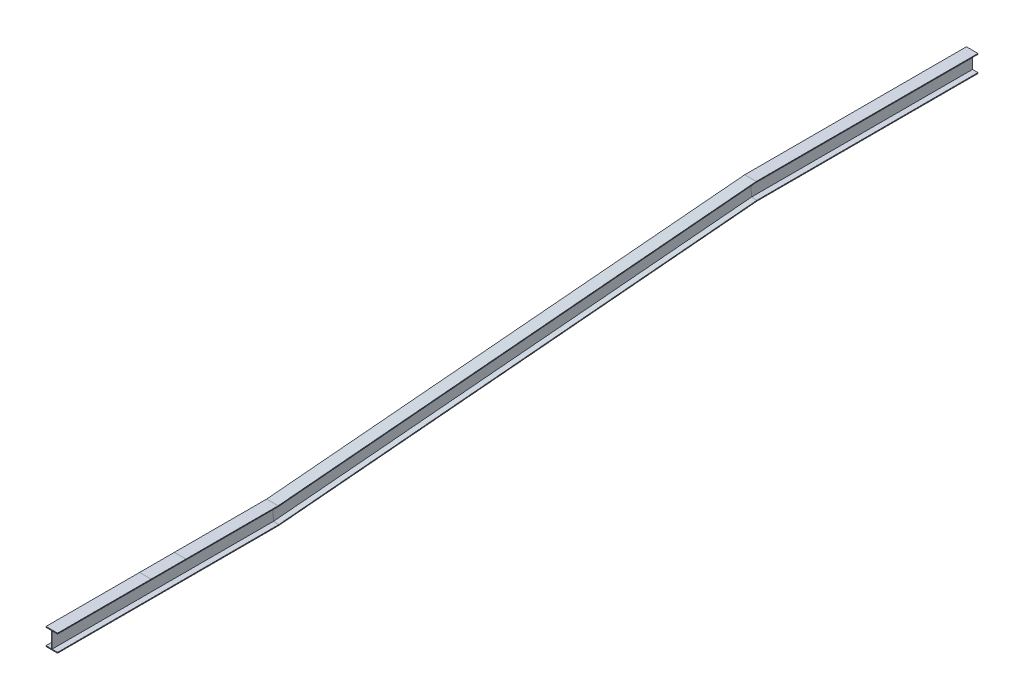
ISO-10303-21;
HEADER;
FILE_DESCRIPTION(('STEP AP214'),'2;1');
FILE_NAME('part.step','',(''),(''),'','','');
FILE_SCHEMA(('AUTOMOTIVE_DESIGN { 1 0 10303 214 1 1 1 1 }'));
ENDSEC;
DATA;
#1=APPLICATION_CONTEXT('core data for automotive mechanical design processes');
#2=APPLICATION_PROTOCOL_DEFINITION('international standard','automotive_design',2000,#1);
#3=PRODUCT_CONTEXT('',#1,'mechanical');
#4=PRODUCT('Part','Part','',(#3));
#5=PRODUCT_RELATED_PRODUCT_CATEGORY('part','',(#4));
#6=PRODUCT_DEFINITION_FORMATION('','',#4);
#7=PRODUCT_DEFINITION_CONTEXT('part definition',#1,'design');
#8=PRODUCT_DEFINITION('design','',#6,#7);
#9=PRODUCT_DEFINITION_SHAPE('','',#8);
#10=(LENGTH_UNIT() NAMED_UNIT(*) SI_UNIT(.MILLI.,.METRE.));
#11=(NAMED_UNIT(*) PLANE_ANGLE_UNIT() SI_UNIT($,.RADIAN.));
#12=(NAMED_UNIT(*) SI_UNIT($,.STERADIAN.) SOLID_ANGLE_UNIT());
#13=UNCERTAINTY_MEASURE_WITH_UNIT(LENGTH_MEASURE(1.E-05),#10,'distance_accuracy_value','');
#14=(GEOMETRIC_REPRESENTATION_CONTEXT(3) GLOBAL_UNCERTAINTY_ASSIGNED_CONTEXT((#13)) GLOBAL_UNIT_ASSIGNED_CONTEXT((#10,
#11,#12)) REPRESENTATION_CONTEXT('',''));
#15=CARTESIAN_POINT('',(0.,0.,0.));
#16=DIRECTION('',(0.,0.,1.));
#17=DIRECTION('',(1.,0.,0.));
#18=AXIS2_PLACEMENT_3D('',#15,#16,#17);
#19=CARTESIAN_POINT('',(0.,-0.000240532957995754,0.));
#20=DIRECTION('',(0.,-1.00000000000002,0.));
#21=DIRECTION('',(0.999999999999975,0.,0.));
#22=AXIS2_PLACEMENT_3D('',#19,#20,#21);
#23=PLANE('',#22);
#24=DIRECTION('',(-0.999999999999975,0.,0.));
#25=VECTOR('',#24,1.);
#26=CARTESIAN_POINT('',(0.,-0.000240532933570847,-1115.72820066556));
#27=LINE('',#26,#25);
#28=CARTESIAN_POINT('',(101.599999999999,-0.000240532933570847,-1115.72820066556));
#29=VERTEX_POINT('',#28);
#30=CARTESIAN_POINT('',(0.,-0.000240532933570847,-1115.72820066556));
#31=VERTEX_POINT('',#30);
#32=EDGE_CURVE('E11',#29,#31,#27,.T.);
#33=ORIENTED_EDGE('',*,*,#32,.F.);
#34=DIRECTION('',(0.,0.,-0.999999999999988));
#35=VECTOR('',#34,1.);
#36=CARTESIAN_POINT('',(101.599999999999,-0.000240532957995754,9.9475983006414E-11));
#37=LINE('',#36,#35);
#38=CARTESIAN_POINT('',(101.599999999994,-0.000240532933570847,-1926.65640133112));
#39=VERTEX_POINT('',#38);
#40=EDGE_CURVE('E228',#29,#39,#37,.T.);
#41=ORIENTED_EDGE('',*,*,#40,.T.);
#42=DIRECTION('',(0.999999999999975,0.,0.));
#43=VECTOR('',#42,1.);
#44=CARTESIAN_POINT('',(-6.21724893790088E-12,-0.000240532933570847,-1926.65640133112));
#45=LINE('',#44,#43);
#46=CARTESIAN_POINT('',(-6.21724893790088E-12,-0.000240532933570847,-1926.65640133112));
#47=VERTEX_POINT('',#46);
#48=EDGE_CURVE('E331',#47,#39,#45,.T.);
#49=ORIENTED_EDGE('',*,*,#48,.F.);
#50=DIRECTION('',(0.,0.,-0.999999999999988));
#51=VECTOR('',#50,1.);
#52=CARTESIAN_POINT('',(0.,-0.000240532957995754,0.));
#53=LINE('',#52,#51);
#54=EDGE_CURVE('E365',#31,#47,#53,.T.);
#55=ORIENTED_EDGE('',*,*,#54,.F.);
#56=EDGE_LOOP('',(#33,#41,#49,#55));
#57=FACE_BOUND('',#56,.T.);
#58=ADVANCED_FACE('F38',(#57),#23,.F.);
#59=DIRECTION('',(0.999999999999975,0.,0.));
#60=VECTOR('',#59,1.);
#61=CARTESIAN_POINT('',(0.,-0.000240532957995754,-810.928200665561));
#62=LINE('',#61,#60);
#63=CARTESIAN_POINT('',(0.,-0.000240532957995754,-810.928200665561));
#64=VERTEX_POINT('',#63);
#65=CARTESIAN_POINT('',(101.6,-0.000240532957995754,-810.928200665559));
#66=VERTEX_POINT('',#65);
#67=EDGE_CURVE('E47',#64,#66,#62,.T.);
#68=ORIENTED_EDGE('',*,*,#67,.F.);
#69=CARTESIAN_POINT('',(-4.9737991503207E-11,-0.000240532957995754,11.1091776840375));
#70=VERTEX_POINT('',#69);
#71=EDGE_CURVE('E367',#70,#64,#53,.T.);
#72=ORIENTED_EDGE('',*,*,#71,.F.);
#73=DIRECTION('',(-0.999999999999975,0.,0.));
#74=VECTOR('',#73,1.);
#75=CARTESIAN_POINT('',(101.599999999952,-0.000240532957995754,11.1091776839416));
#76=LINE('',#75,#74);
#77=CARTESIAN_POINT('',(101.599999999951,-0.000240532957995754,11.1091776839416));
#78=VERTEX_POINT('',#77);
#79=EDGE_CURVE('E239',#78,#70,#76,.T.);
#80=ORIENTED_EDGE('',*,*,#79,.F.);
#81=EDGE_CURVE('E235',#78,#66,#37,.T.);
#82=ORIENTED_EDGE('',*,*,#81,.T.);
#83=EDGE_LOOP('',(#68,#72,#80,#82));
#84=FACE_BOUND('',#83,.T.);
#85=ADVANCED_FACE('F477',(#84),#23,.F.);
#86=CARTESIAN_POINT('',(47.5660357142855,221.295206381576,-6124.99971287875));
#87=DIRECTION('',(0.999999999999975,0.,0.));
#88=DIRECTION('',(0.,0.,-0.999999999999988));
#89=AXIS2_PLACEMENT_3D('',#86,#87,#88);
#90=PLANE('',#89);
#91=DIRECTION('',(0.,0.999048221581882,0.0436193873653391));
#92=VECTOR('',#91,1.);
#93=CARTESIAN_POINT('',(47.5660357142367,37.5900227922892,-6139.83149499006));
#94=LINE('',#93,#92);
#95=CARTESIAN_POINT('',(47.5660357142855,221.295206381576,-6131.81075345742));
#96=VERTEX_POINT('',#95);
#97=CARTESIAN_POINT('',(47.5660357142855,360.233206381576,-6125.7445893716));
#98=VERTEX_POINT('',#97);
#99=EDGE_CURVE('E408',#96,#98,#94,.T.);
#100=ORIENTED_EDGE('',*,*,#99,.T.);
#101=DIRECTION('',(0.,0.,-0.999999999999988));
#102=VECTOR('',#101,1.);
#103=CARTESIAN_POINT('',(47.5660357142855,360.233206381576,-6124.99971287875));
#104=LINE('',#103,#102);
#105=CARTESIAN_POINT('',(47.5660357142793,360.233206381601,-8073.3192700833));
#106=VERTEX_POINT('',#105);
#107=EDGE_CURVE('E413',#98,#106,#104,.T.);
#108=ORIENTED_EDGE('',*,*,#107,.T.);
#109=DIRECTION('',(0.,1.00000000000002,0.));
#110=VECTOR('',#109,1.);
#111=CARTESIAN_POINT('',(47.5660357142367,221.295206381602,-8073.3192700832));
#112=LINE('',#111,#110);
#113=CARTESIAN_POINT('',(47.5660357142367,221.295206381601,-8073.3192700832));
#114=VERTEX_POINT('',#113);
#115=EDGE_CURVE('E245',#114,#106,#112,.T.);
#116=ORIENTED_EDGE('',*,*,#115,.F.);
#117=DIRECTION('',(0.,0.,-0.999999999999988));
#118=VECTOR('',#117,1.);
#119=CARTESIAN_POINT('',(47.5660357142855,221.295206381576,-6124.99971287875));
#120=LINE('',#119,#118);
#121=EDGE_CURVE('E467',#96,#114,#120,.T.);
#122=ORIENTED_EDGE('',*,*,#121,.F.);
#123=EDGE_LOOP('',(#100,#108,#116,#122));
#124=FACE_BOUND('',#123,.T.);
#125=ADVANCED_FACE('F576',(#124),#90,.F.);
#126=CARTESIAN_POINT('',(0.,221.295206381626,-6124.9997128787));
#127=DIRECTION('',(0.,-1.00000000000002,0.));
#128=DIRECTION('',(0.999999999999975,0.,0.));
#129=AXIS2_PLACEMENT_3D('',#126,#127,#128);
#130=PLANE('',#129);
#131=DIRECTION('',(0.999999999999975,0.,0.));
#132=VECTOR('',#131,1.);
#133=CARTESIAN_POINT('',(0.,221.295206381626,-6131.81075345737));
#134=LINE('',#133,#132);
#135=CARTESIAN_POINT('',(0.,221.295206381626,-6131.81075345737));
#136=VERTEX_POINT('',#135);
#137=EDGE_CURVE('E348',#136,#96,#134,.T.);
#138=ORIENTED_EDGE('',*,*,#137,.T.);
#139=ORIENTED_EDGE('',*,*,#121,.T.);
#140=DIRECTION('',(0.999999999999975,0.,0.));
#141=VECTOR('',#140,1.);
#142=CARTESIAN_POINT('',(-5.06261699229071E-11,221.29520638165,-8073.3192700832));
#143=LINE('',#142,#141);
#144=CARTESIAN_POINT('',(-4.9737991503207E-11,221.29520638165,-8073.3192700832));
#145=VERTEX_POINT('',#144);
#146=EDGE_CURVE('E276',#145,#114,#143,.T.);
#147=ORIENTED_EDGE('',*,*,#146,.F.);
#148=DIRECTION('',(0.,0.,-0.999999999999988));
#149=VECTOR('',#148,1.);
#150=CARTESIAN_POINT('',(0.,221.295206381626,-6124.9997128787));
#151=LINE('',#150,#149);
#152=EDGE_CURVE('E465',#136,#145,#151,.T.);
#153=ORIENTED_EDGE('',*,*,#152,.F.);
#154=EDGE_LOOP('',(#138,#139,#147,#153));
#155=FACE_BOUND('',#154,.T.);
#156=ADVANCED_FACE('F579',(#155),#130,.F.);
#157=CARTESIAN_POINT('',(0.,214.183206381625,-6124.9997128787));
#158=DIRECTION('',(0.999999999999975,0.,0.));
#159=DIRECTION('',(0.,0.,-0.999999999999988));
#160=AXIS2_PLACEMENT_3D('',#157,#158,#159);
#161=PLANE('',#160);
#162=DIRECTION('',(0.,0.999048221581882,0.0436193873653391));
#163=VECTOR('',#162,1.);
#164=CARTESIAN_POINT('',(-5.50670620214078E-11,30.4915544459243,-6140.14142081132));
#165=LINE('',#164,#163);
#166=CARTESIAN_POINT('',(0.,214.183206381626,-6132.12127008334));
#167=VERTEX_POINT('',#166);
#168=EDGE_CURVE('E378',#167,#136,#165,.T.);
#169=ORIENTED_EDGE('',*,*,#168,.T.);
#170=ORIENTED_EDGE('',*,*,#152,.T.);
#171=DIRECTION('',(0.,1.00000000000002,0.));
#172=VECTOR('',#171,1.);
#173=CARTESIAN_POINT('',(0.,214.183206381652,-8073.3192700832));
#174=LINE('',#173,#172);
#175=CARTESIAN_POINT('',(0.,214.18320638165,-8073.3192700832));
#176=VERTEX_POINT('',#175);
#177=EDGE_CURVE('E280',#176,#145,#174,.T.);
#178=ORIENTED_EDGE('',*,*,#177,.F.);
#179=DIRECTION('',(0.,0.,-0.999999999999988));
#180=VECTOR('',#179,1.);
#181=CARTESIAN_POINT('',(0.,214.183206381625,-6124.9997128787));
#182=LINE('',#181,#180);
#183=EDGE_CURVE('E463',#167,#176,#182,.T.);
#184=ORIENTED_EDGE('',*,*,#183,.F.);
#185=EDGE_LOOP('',(#169,#170,#178,#184));
#186=FACE_BOUND('',#185,.T.);
#187=ADVANCED_FACE('F582',(#186),#161,.F.);
#188=CARTESIAN_POINT('',(101.599999999993,214.183206381625,-6124.9997128787));
#189=DIRECTION('',(0.,1.00000000000002,0.));
#190=DIRECTION('',(0.,0.,0.999999999999988));
#191=AXIS2_PLACEMENT_3D('',#188,#189,#190);
#192=PLANE('',#191);
#193=DIRECTION('',(-0.999999999999975,0.,0.));
#194=VECTOR('',#193,1.);
#195=CARTESIAN_POINT('',(101.599999999999,214.183206381625,-6132.12127008334));
#196=LINE('',#195,#194);
#197=CARTESIAN_POINT('',(101.599999999999,214.183206381625,-6132.12127008334));
#198=VERTEX_POINT('',#197);
#199=EDGE_CURVE('E381',#198,#167,#196,.T.);
#200=ORIENTED_EDGE('',*,*,#199,.T.);
#201=ORIENTED_EDGE('',*,*,#183,.T.);
#202=DIRECTION('',(-0.999999999999975,0.,0.));
#203=VECTOR('',#202,1.);
#204=CARTESIAN_POINT('',(101.599999999997,214.18320638165,-8073.3192700833));
#205=LINE('',#204,#203);
#206=CARTESIAN_POINT('',(101.599999999999,214.18320638165,-8073.3192700833));
#207=VERTEX_POINT('',#206);
#208=EDGE_CURVE('E283',#207,#176,#205,.T.);
#209=ORIENTED_EDGE('',*,*,#208,.F.);
#210=DIRECTION('',(0.,0.,-0.999999999999988));
#211=VECTOR('',#210,1.);
#212=CARTESIAN_POINT('',(101.599999999993,214.183206381625,-6124.9997128787));
#213=LINE('',#212,#211);
#214=EDGE_CURVE('E461',#198,#207,#213,.T.);
#215=ORIENTED_EDGE('',*,*,#214,.F.);
#216=EDGE_LOOP('',(#200,#201,#209,#215));
#217=FACE_BOUND('',#216,.T.);
#218=ADVANCED_FACE('F585',(#217),#192,.F.);
#219=CARTESIAN_POINT('',(101.599999999999,221.295206381626,-6124.9997128787));
#220=DIRECTION('',(-0.999999999999975,0.,0.));
#221=DIRECTION('',(0.,0.,0.999999999999988));
#222=AXIS2_PLACEMENT_3D('',#219,#220,#221);
#223=PLANE('',#222);
#224=DIRECTION('',(0.,-0.999048221581882,-0.0436193873653391));
#225=VECTOR('',#224,1.);
#226=CARTESIAN_POINT('',(101.599999999951,37.5900227923389,-6139.83149499011));
#227=LINE('',#226,#225);
#228=CARTESIAN_POINT('',(101.599999999999,221.295206381626,-6131.81075345737));
#229=VERTEX_POINT('',#228);
#230=EDGE_CURVE('E384',#229,#198,#227,.T.);
#231=ORIENTED_EDGE('',*,*,#230,.T.);
#232=ORIENTED_EDGE('',*,*,#214,.T.);
#233=DIRECTION('',(0.,-1.00000000000002,0.));
#234=VECTOR('',#233,1.);
#235=CARTESIAN_POINT('',(101.599999999951,221.295206381651,-8073.3192700833));
#236=LINE('',#235,#234);
#237=CARTESIAN_POINT('',(101.599999999951,221.29520638165,-8073.3192700833));
#238=VERTEX_POINT('',#237);
#239=EDGE_CURVE('E286',#238,#207,#236,.T.);
#240=ORIENTED_EDGE('',*,*,#239,.F.);
#241=DIRECTION('',(0.,0.,-0.999999999999988));
#242=VECTOR('',#241,1.);
#243=CARTESIAN_POINT('',(101.599999999999,221.295206381626,-6124.9997128787));
#244=LINE('',#243,#242);
#245=EDGE_CURVE('E459',#229,#238,#244,.T.);
#246=ORIENTED_EDGE('',*,*,#245,.F.);
#247=EDGE_LOOP('',(#231,#232,#240,#246));
#248=FACE_BOUND('',#247,.T.);
#249=ADVANCED_FACE('F588',(#248),#223,.F.);
#250=CARTESIAN_POINT('',(53.4080357142859,221.295206381576,-6124.99971287875));
#251=DIRECTION('',(0.,-1.00000000000002,0.));
#252=DIRECTION('',(0.999999999999975,0.,0.));
#253=AXIS2_PLACEMENT_3D('',#250,#251,#252);
#254=PLANE('',#253);
#255=DIRECTION('',(0.999999999999975,0.,0.));
#256=VECTOR('',#255,1.);
#257=CARTESIAN_POINT('',(53.408035714285,221.295206381576,-6131.81075345742));
#258=LINE('',#257,#256);
#259=CARTESIAN_POINT('',(53.408035714285,221.295206381576,-6131.81075345742));
#260=VERTEX_POINT('',#259);
#261=EDGE_CURVE('E387',#260,#229,#258,.T.);
#262=ORIENTED_EDGE('',*,*,#261,.T.);
#263=ORIENTED_EDGE('',*,*,#245,.T.);
#264=DIRECTION('',(0.999999999999975,0.,0.));
#265=VECTOR('',#264,1.);
#266=CARTESIAN_POINT('',(53.4080357142344,221.295206381601,-8073.3192700832));
#267=LINE('',#266,#265);
#268=CARTESIAN_POINT('',(53.4080357142361,221.295206381601,-8073.3192700832));
#269=VERTEX_POINT('',#268);
#270=EDGE_CURVE('E289',#269,#238,#267,.T.);
#271=ORIENTED_EDGE('',*,*,#270,.F.);
#272=DIRECTION('',(0.,0.,-0.999999999999988));
#273=VECTOR('',#272,1.);
#274=CARTESIAN_POINT('',(53.4080357142859,221.295206381576,-6124.99971287875));
#275=LINE('',#274,#273);
#276=EDGE_CURVE('E457',#260,#269,#275,.T.);
#277=ORIENTED_EDGE('',*,*,#276,.F.);
#278=EDGE_LOOP('',(#262,#263,#271,#277));
#279=FACE_BOUND('',#278,.T.);
#280=ADVANCED_FACE('F555',(#279),#254,.F.);
#281=CARTESIAN_POINT('',(53.4080357142859,360.233206381576,-6124.99971287875));
#282=DIRECTION('',(-0.999999999999975,0.,0.));
#283=DIRECTION('',(0.,-1.00000000000002,0.));
#284=AXIS2_PLACEMENT_3D('',#281,#282,#283);
#285=PLANE('',#284);
#286=DIRECTION('',(0.,-0.999048221581882,-0.0436193873653391));
#287=VECTOR('',#286,1.);
#288=CARTESIAN_POINT('',(53.4080357142859,176.263672274025,-6133.77687269712));
#289=LINE('',#288,#287);
#290=CARTESIAN_POINT('',(53.4080357142859,360.233206381576,-6125.7445893716));
#291=VERTEX_POINT('',#290);
#292=EDGE_CURVE('E390',#291,#260,#289,.T.);
#293=ORIENTED_EDGE('',*,*,#292,.T.);
#294=ORIENTED_EDGE('',*,*,#276,.T.);
#295=DIRECTION('',(0.,-1.00000000000002,0.));
#296=VECTOR('',#295,1.);
#297=CARTESIAN_POINT('',(53.4080357142797,360.233206381602,-8073.3192700833));
#298=LINE('',#297,#296);
#299=CARTESIAN_POINT('',(53.4080357142797,360.233206381601,-8073.3192700833));
#300=VERTEX_POINT('',#299);
#301=EDGE_CURVE('E292',#300,#269,#298,.T.);
#302=ORIENTED_EDGE('',*,*,#301,.F.);
#303=DIRECTION('',(0.,0.,-0.999999999999988));
#304=VECTOR('',#303,1.);
#305=CARTESIAN_POINT('',(53.4080357142859,360.233206381576,-6124.99971287875));
#306=LINE('',#305,#304);
#307=EDGE_CURVE('E455',#291,#300,#306,.T.);
#308=ORIENTED_EDGE('',*,*,#307,.F.);
#309=EDGE_LOOP('',(#293,#294,#302,#308));
#310=FACE_BOUND('',#309,.T.);
#311=ADVANCED_FACE('F558',(#310),#285,.F.);
#312=CARTESIAN_POINT('',(101.599999999999,360.233206381626,-6124.9997128787));
#313=DIRECTION('',(0.,1.00000000000002,0.));
#314=DIRECTION('',(-0.999999999999975,0.,0.));
#315=AXIS2_PLACEMENT_3D('',#312,#313,#314);
#316=PLANE('',#315);
#317=DIRECTION('',(-0.999999999999975,0.,0.));
#318=VECTOR('',#317,1.);
#319=CARTESIAN_POINT('',(101.599999999999,360.233206381625,-6125.74458937155));
#320=LINE('',#319,#318);
#321=CARTESIAN_POINT('',(101.599999999999,360.233206381626,-6125.74458937155));
#322=VERTEX_POINT('',#321);
#323=EDGE_CURVE('E393',#322,#291,#320,.T.);
#324=ORIENTED_EDGE('',*,*,#323,.T.);
#325=ORIENTED_EDGE('',*,*,#307,.T.);
#326=DIRECTION('',(-0.999999999999975,0.,0.));
#327=VECTOR('',#326,1.);
#328=CARTESIAN_POINT('',(101.599999999992,360.23320638165,-8073.3192700832));
#329=LINE('',#328,#327);
#330=CARTESIAN_POINT('',(101.599999999994,360.23320638165,-8073.3192700832));
#331=VERTEX_POINT('',#330);
#332=EDGE_CURVE('E295',#331,#300,#329,.T.);
#333=ORIENTED_EDGE('',*,*,#332,.F.);
#334=DIRECTION('',(0.,0.,-0.999999999999988));
#335=VECTOR('',#334,1.);
#336=CARTESIAN_POINT('',(101.599999999999,360.233206381626,-6124.9997128787));
#337=LINE('',#336,#335);
#338=EDGE_CURVE('E453',#322,#331,#337,.T.);
#339=ORIENTED_EDGE('',*,*,#338,.F.);
#340=EDGE_LOOP('',(#324,#325,#333,#339));
#341=FACE_BOUND('',#340,.T.);
#342=ADVANCED_FACE('F561',(#341),#316,.F.);
#343=CARTESIAN_POINT('',(101.599999999999,367.345206381625,-6124.9997128787));
#344=DIRECTION('',(-0.999999999999975,0.,0.));
#345=DIRECTION('',(0.,0.,0.999999999999988));
#346=AXIS2_PLACEMENT_3D('',#343,#344,#345);
#347=PLANE('',#346);
#348=DIRECTION('',(0.,-0.999048221581882,-0.0436193873653391));
#349=VECTOR('',#348,1.);
#350=CARTESIAN_POINT('',(101.599999999999,183.362140620488,-6133.46694687596));
#351=LINE('',#350,#349);
#352=CARTESIAN_POINT('',(101.599999999994,367.345206381625,-6125.43407274558));
#353=VERTEX_POINT('',#352);
#354=EDGE_CURVE('E396',#353,#322,#351,.T.);
#355=ORIENTED_EDGE('',*,*,#354,.T.);
#356=ORIENTED_EDGE('',*,*,#338,.T.);
#357=DIRECTION('',(0.,-1.00000000000002,0.));
#358=VECTOR('',#357,1.);
#359=CARTESIAN_POINT('',(101.599999999999,367.345206381652,-8073.3192700832));
#360=LINE('',#359,#358);
#361=CARTESIAN_POINT('',(101.599999999999,367.34520638165,-8073.3192700832));
#362=VERTEX_POINT('',#361);
#363=EDGE_CURVE('E298',#362,#331,#360,.T.);
#364=ORIENTED_EDGE('',*,*,#363,.F.);
#365=DIRECTION('',(0.,0.,-0.999999999999988));
#366=VECTOR('',#365,1.);
#367=CARTESIAN_POINT('',(101.599999999999,367.345206381625,-6124.9997128787));
#368=LINE('',#367,#366);
#369=EDGE_CURVE('E451',#353,#362,#368,.T.);
#370=ORIENTED_EDGE('',*,*,#369,.F.);
#371=EDGE_LOOP('',(#355,#356,#364,#370));
#372=FACE_BOUND('',#371,.T.);
#373=ADVANCED_FACE('F565',(#372),#347,.F.);
#374=CARTESIAN_POINT('',(0.,367.345206381625,-6124.9997128787));
#375=DIRECTION('',(0.,-1.00000000000002,0.));
#376=DIRECTION('',(0.999999999999975,0.,0.));
#377=AXIS2_PLACEMENT_3D('',#374,#375,#376);
#378=PLANE('',#377);
#379=DIRECTION('',(0.999999999999975,0.,0.));
#380=VECTOR('',#379,1.);
#381=CARTESIAN_POINT('',(0.,367.345206381625,-6125.43407274558));
#382=LINE('',#381,#380);
#383=CARTESIAN_POINT('',(0.,367.345206381625,-6125.43407274558));
#384=VERTEX_POINT('',#383);
#385=EDGE_CURVE('E399',#384,#353,#382,.T.);
#386=ORIENTED_EDGE('',*,*,#385,.T.);
#387=ORIENTED_EDGE('',*,*,#369,.T.);
#388=DIRECTION('',(0.999999999999975,0.,0.));
#389=VECTOR('',#388,1.);
#390=CARTESIAN_POINT('',(-1.77635683940025E-12,367.34520638165,-8073.3192700833));
#391=LINE('',#390,#389);
#392=CARTESIAN_POINT('',(0.,367.34520638165,-8073.3192700833));
#393=VERTEX_POINT('',#392);
#394=EDGE_CURVE('E301',#393,#362,#391,.T.);
#395=ORIENTED_EDGE('',*,*,#394,.F.);
#396=DIRECTION('',(0.,0.,-0.999999999999988));
#397=VECTOR('',#396,1.);
#398=CARTESIAN_POINT('',(0.,367.345206381625,-6124.9997128787));
#399=LINE('',#398,#397);
#400=EDGE_CURVE('E449',#384,#393,#399,.T.);
#401=ORIENTED_EDGE('',*,*,#400,.F.);
#402=EDGE_LOOP('',(#386,#387,#395,#401));
#403=FACE_BOUND('',#402,.T.);
#404=ADVANCED_FACE('F568',(#403),#378,.F.);
#405=CARTESIAN_POINT('',(0.,360.233206381626,-6124.9997128787));
#406=DIRECTION('',(0.999999999999975,0.,0.));
#407=DIRECTION('',(0.,0.,-0.999999999999988));
#408=AXIS2_PLACEMENT_3D('',#405,#406,#407);
#409=PLANE('',#408);
#410=DIRECTION('',(0.,0.999048221581883,0.0436193873653391));
#411=VECTOR('',#410,1.);
#412=CARTESIAN_POINT('',(0.,176.263672274074,-6133.77687269718));
#413=LINE('',#412,#411);
#414=CARTESIAN_POINT('',(0.,360.233206381626,-6125.74458937155));
#415=VERTEX_POINT('',#414);
#416=EDGE_CURVE('E402',#415,#384,#413,.T.);
#417=ORIENTED_EDGE('',*,*,#416,.T.);
#418=ORIENTED_EDGE('',*,*,#400,.T.);
#419=DIRECTION('',(0.,1.00000000000002,0.));
#420=VECTOR('',#419,1.);
#421=CARTESIAN_POINT('',(-6.21724893790088E-12,360.233206381651,-8073.3192700833));
#422=LINE('',#421,#420);
#423=CARTESIAN_POINT('',(-6.21724893790088E-12,360.23320638165,-8073.3192700833));
#424=VERTEX_POINT('',#423);
#425=EDGE_CURVE('E304',#424,#393,#422,.T.);
#426=ORIENTED_EDGE('',*,*,#425,.F.);
#427=DIRECTION('',(0.,0.,-0.999999999999988));
#428=VECTOR('',#427,1.);
#429=CARTESIAN_POINT('',(0.,360.233206381626,-6124.9997128787));
#430=LINE('',#429,#428);
#431=EDGE_CURVE('E279',#415,#424,#430,.T.);
#432=ORIENTED_EDGE('',*,*,#431,.F.);
#433=EDGE_LOOP('',(#417,#418,#426,#432));
#434=FACE_BOUND('',#433,.T.);
#435=ADVANCED_FACE('F571',(#434),#409,.F.);
#436=CARTESIAN_POINT('',(47.5660357142855,360.233206381576,-6124.99971287875));
#437=DIRECTION('',(0.,1.00000000000002,0.));
#438=DIRECTION('',(-0.999999999999975,0.,0.));
#439=AXIS2_PLACEMENT_3D('',#436,#437,#438);
#440=PLANE('',#439);
#441=DIRECTION('',(-0.999999999999975,0.,0.));
#442=VECTOR('',#441,1.);
#443=CARTESIAN_POINT('',(47.5660357142855,360.233206381576,-6125.7445893716));
#444=LINE('',#443,#442);
#445=EDGE_CURVE('E405',#98,#415,#444,.T.);
#446=ORIENTED_EDGE('',*,*,#445,.T.);
#447=ORIENTED_EDGE('',*,*,#431,.T.);
#448=DIRECTION('',(-0.999999999999975,0.,0.));
#449=VECTOR('',#448,1.);
#450=CARTESIAN_POINT('',(47.5660357142775,360.233206381601,-8073.3192700833));
#451=LINE('',#450,#449);
#452=EDGE_CURVE('E248',#106,#424,#451,.T.);
#453=ORIENTED_EDGE('',*,*,#452,.F.);
#454=ORIENTED_EDGE('',*,*,#107,.F.);
#455=EDGE_LOOP('',(#446,#447,#453,#454));
#456=FACE_BOUND('',#455,.T.);
#457=ADVANCED_FACE('F40',(#456),#440,.F.);
#458=CARTESIAN_POINT('',(47.5660357142358,-7.70586183350197,-1920.18179544407));
#459=DIRECTION('',(0.,0.99619469809177,0.0871557427476643));
#460=DIRECTION('',(0.,-0.0871557427476674,0.996194698091732));
#461=AXIS2_PLACEMENT_3D('',#458,#459,#460);
#462=PLANE('',#461);
#463=DIRECTION('',(0.,0.0871557427476674,-0.996194698091732));
#464=VECTOR('',#463,1.);
#465=CARTESIAN_POINT('',(47.5660357142358,-7.70586183350197,-1920.18179544407));
#466=LINE('',#465,#464);
#467=CARTESIAN_POINT('',(47.5660357142855,-7.11224053298309,-1926.96691795704));
#468=VERTEX_POINT('',#467);
#469=EDGE_CURVE('E443',#468,#98,#466,.T.);
#470=ORIENTED_EDGE('',*,*,#469,.F.);
#471=DIRECTION('',(-0.999999999999975,0.,0.));
#472=VECTOR('',#471,1.);
#473=CARTESIAN_POINT('',(47.5660357142855,-7.11224053298309,-1926.96691795704));
#474=LINE('',#473,#472);
#475=CARTESIAN_POINT('',(0.,-7.11224053293336,-1926.96691795709));
#476=VERTEX_POINT('',#475);
#477=EDGE_CURVE('E337',#468,#476,#474,.T.);
#478=ORIENTED_EDGE('',*,*,#477,.T.);
#479=DIRECTION('',(0.,0.0871557427476674,-0.996194698091732));
#480=VECTOR('',#479,1.);
#481=CARTESIAN_POINT('',(-4.9737991503207E-11,-7.7058618334771,-1920.18179544412));
#482=LINE('',#481,#480);
#483=EDGE_CURVE('E409',#476,#415,#482,.T.);
#484=ORIENTED_EDGE('',*,*,#483,.T.);
#485=ORIENTED_EDGE('',*,*,#445,.F.);
#486=EDGE_LOOP('',(#470,#478,#484,#485));
#487=FACE_BOUND('',#486,.T.);
#488=ADVANCED_FACE('F531',(#487),#462,.F.);
#489=CARTESIAN_POINT('',(-4.9737991503207E-11,-7.7058618334771,-1920.18179544412));
#490=DIRECTION('',(0.999999999999975,0.,0.));
#491=DIRECTION('',(0.,0.,-0.999999999999988));
#492=AXIS2_PLACEMENT_3D('',#489,#490,#491);
#493=PLANE('',#492);
#494=ORIENTED_EDGE('',*,*,#483,.F.);
#495=DIRECTION('',(0.,0.999048221581883,0.0436193873653391));
#496=VECTOR('',#495,1.);
#497=CARTESIAN_POINT('',(0.,76.8608759594316,-1923.30057251207));
#498=LINE('',#497,#496);
#499=EDGE_CURVE('E334',#476,#47,#498,.T.);
#500=ORIENTED_EDGE('',*,*,#499,.T.);
#501=DIRECTION('',(0.,0.0871557427476674,-0.996194698091732));
#502=VECTOR('',#501,1.);
#503=CARTESIAN_POINT('',(-4.9737991503207E-11,-0.620925140648598,-1919.5619438017));
#504=LINE('',#503,#502);
#505=EDGE_CURVE('E412',#47,#384,#504,.T.);
#506=ORIENTED_EDGE('',*,*,#505,.T.);
#507=ORIENTED_EDGE('',*,*,#416,.F.);
#508=EDGE_LOOP('',(#494,#500,#506,#507));
#509=FACE_BOUND('',#508,.T.);
#510=ADVANCED_FACE('F528',(#509),#493,.F.);
#511=CARTESIAN_POINT('',(-4.9737991503207E-11,-0.620925140648598,-1919.5619438017));
#512=DIRECTION('',(0.,-0.99619469809177,-0.0871557427476643));
#513=DIRECTION('',(0.,0.0871557427476674,-0.996194698091732));
#514=AXIS2_PLACEMENT_3D('',#511,#512,#513);
#515=PLANE('',#514);
#516=ORIENTED_EDGE('',*,*,#505,.F.);
#517=ORIENTED_EDGE('',*,*,#48,.T.);
#518=DIRECTION('',(0.,0.0871557427476674,-0.996194698091732));
#519=VECTOR('',#518,1.);
#520=CARTESIAN_POINT('',(101.599999999951,-0.620925140648598,-1919.5619438017));
#521=LINE('',#520,#519);
#522=EDGE_CURVE('E416',#39,#353,#521,.T.);
#523=ORIENTED_EDGE('',*,*,#522,.T.);
#524=ORIENTED_EDGE('',*,*,#385,.F.);
#525=EDGE_LOOP('',(#516,#517,#523,#524));
#526=FACE_BOUND('',#525,.T.);
#527=ADVANCED_FACE('F525',(#526),#515,.F.);
#528=CARTESIAN_POINT('',(101.599999999951,-0.620925140648598,-1919.5619438017));
#529=DIRECTION('',(-0.999999999999975,0.,0.));
#530=DIRECTION('',(0.,0.,0.999999999999988));
#531=AXIS2_PLACEMENT_3D('',#528,#529,#530);
#532=PLANE('',#531);
#533=ORIENTED_EDGE('',*,*,#522,.F.);
#534=DIRECTION('',(0.,-0.999048221581883,-0.0436193873653391));
#535=VECTOR('',#534,1.);
#536=CARTESIAN_POINT('',(101.599999999993,83.9593443058222,-1922.99064669085));
#537=LINE('',#536,#535);
#538=CARTESIAN_POINT('',(101.599999999994,-7.11224053293336,-1926.96691795709));
#539=VERTEX_POINT('',#538);
#540=EDGE_CURVE('E328',#39,#539,#537,.T.);
#541=ORIENTED_EDGE('',*,*,#540,.T.);
#542=DIRECTION('',(0.,0.0871557427476674,-0.996194698091732));
#543=VECTOR('',#542,1.);
#544=CARTESIAN_POINT('',(101.599999999951,-7.7058618334771,-1920.18179544412));
#545=LINE('',#544,#543);
#546=EDGE_CURVE('E419',#539,#322,#545,.T.);
#547=ORIENTED_EDGE('',*,*,#546,.T.);
#548=ORIENTED_EDGE('',*,*,#354,.F.);
#549=EDGE_LOOP('',(#533,#541,#547,#548));
#550=FACE_BOUND('',#549,.T.);
#551=ADVANCED_FACE('F519',(#550),#532,.F.);
#552=CARTESIAN_POINT('',(101.599999999951,-7.7058618334771,-1920.18179544412));
#553=DIRECTION('',(0.,0.99619469809177,0.0871557427476643));
#554=DIRECTION('',(0.,-0.0871557427476674,0.996194698091732));
#555=AXIS2_PLACEMENT_3D('',#552,#553,#554);
#556=PLANE('',#555);
#557=ORIENTED_EDGE('',*,*,#546,.F.);
#558=DIRECTION('',(-0.999999999999975,0.,0.));
#559=VECTOR('',#558,1.);
#560=CARTESIAN_POINT('',(101.599999999994,-7.11224053293336,-1926.96691795709));
#561=LINE('',#560,#559);
#562=CARTESIAN_POINT('',(53.4080357142859,-7.11224053298309,-1926.96691795704));
#563=VERTEX_POINT('',#562);
#564=EDGE_CURVE('E225',#539,#563,#561,.T.);
#565=ORIENTED_EDGE('',*,*,#564,.T.);
#566=DIRECTION('',(0.,0.0871557427476674,-0.996194698091732));
#567=VECTOR('',#566,1.);
#568=CARTESIAN_POINT('',(53.4080357142361,-7.70586183350197,-1920.18179544407));
#569=LINE('',#568,#567);
#570=EDGE_CURVE('E422',#563,#291,#569,.T.);
#571=ORIENTED_EDGE('',*,*,#570,.T.);
#572=ORIENTED_EDGE('',*,*,#323,.F.);
#573=EDGE_LOOP('',(#557,#565,#571,#572));
#574=FACE_BOUND('',#573,.T.);
#575=ADVANCED_FACE('F515',(#574),#556,.F.);
#576=CARTESIAN_POINT('',(53.4080357142361,-7.70586183350197,-1920.18179544407));
#577=DIRECTION('',(-0.999999999999975,0.,0.));
#578=DIRECTION('',(0.,-1.00000000000002,0.));
#579=AXIS2_PLACEMENT_3D('',#576,#577,#578);
#580=PLANE('',#579);
#581=ORIENTED_EDGE('',*,*,#570,.F.);
#582=DIRECTION('',(0.,-0.999048221581883,-0.0436193873653391));
#583=VECTOR('',#582,1.);
#584=CARTESIAN_POINT('',(53.408035714285,76.8608759593823,-1923.30057251206));
#585=LINE('',#584,#583);
#586=CARTESIAN_POINT('',(53.4080357142797,-146.050240532983,-1933.03308204286));
#587=VERTEX_POINT('',#586);
#588=EDGE_CURVE('E324',#563,#587,#585,.T.);
#589=ORIENTED_EDGE('',*,*,#588,.T.);
#590=DIRECTION('',(0.,0.0871557427476674,-0.996194698091732));
#591=VECTOR('',#590,1.);
#592=CARTESIAN_POINT('',(53.408035714285,-146.115160796973,-1932.29104002995));
#593=LINE('',#592,#591);
#594=EDGE_CURVE('E425',#587,#260,#593,.T.);
#595=ORIENTED_EDGE('',*,*,#594,.T.);
#596=ORIENTED_EDGE('',*,*,#292,.F.);
#597=EDGE_LOOP('',(#581,#589,#595,#596));
#598=FACE_BOUND('',#597,.T.);
#599=ADVANCED_FACE('F512',(#598),#580,.F.);
#600=CARTESIAN_POINT('',(53.408035714285,-146.115160796973,-1932.29104002995));
#601=DIRECTION('',(0.,-0.99619469809177,-0.0871557427476643));
#602=DIRECTION('',(0.,0.0871557427476674,-0.996194698091732));
#603=AXIS2_PLACEMENT_3D('',#600,#601,#602);
#604=PLANE('',#603);
#605=ORIENTED_EDGE('',*,*,#594,.F.);
#606=DIRECTION('',(0.999999999999975,0.,0.));
#607=VECTOR('',#606,1.);
#608=CARTESIAN_POINT('',(53.4080357142797,-146.050240532983,-1933.03308204286));
#609=LINE('',#608,#607);
#610=CARTESIAN_POINT('',(101.599999999993,-146.050240532933,-1933.03308204291));
#611=VERTEX_POINT('',#610);
#612=EDGE_CURVE('E321',#587,#611,#609,.T.);
#613=ORIENTED_EDGE('',*,*,#612,.T.);
#614=DIRECTION('',(0.,0.0871557427476674,-0.996194698091732));
#615=VECTOR('',#614,1.);
#616=CARTESIAN_POINT('',(101.599999999993,-146.115160796923,-1932.29104003));
#617=LINE('',#616,#615);
#618=EDGE_CURVE('E428',#611,#229,#617,.T.);
#619=ORIENTED_EDGE('',*,*,#618,.T.);
#620=ORIENTED_EDGE('',*,*,#261,.F.);
#621=EDGE_LOOP('',(#605,#613,#619,#620));
#622=FACE_BOUND('',#621,.T.);
#623=ADVANCED_FACE('F551',(#622),#604,.F.);
#624=CARTESIAN_POINT('',(101.599999999993,-146.115160796923,-1932.29104003));
#625=DIRECTION('',(-0.999999999999975,0.,0.));
#626=DIRECTION('',(0.,0.,0.999999999999988));
#627=AXIS2_PLACEMENT_3D('',#624,#625,#626);
#628=PLANE('',#627);
#629=ORIENTED_EDGE('',*,*,#618,.F.);
#630=DIRECTION('',(0.,-0.999048221581883,-0.0436193873653391));
#631=VECTOR('',#630,1.);
#632=CARTESIAN_POINT('',(101.599999999944,-61.8127735223037,-1929.355194805));
#633=LINE('',#632,#631);
#634=CARTESIAN_POINT('',(101.599999999999,-153.162240532934,-1933.34359866888));
#635=VERTEX_POINT('',#634);
#636=EDGE_CURVE('E318',#611,#635,#633,.T.);
#637=ORIENTED_EDGE('',*,*,#636,.T.);
#638=DIRECTION('',(0.,0.0871557427476674,-0.996194698091732));
#639=VECTOR('',#638,1.);
#640=CARTESIAN_POINT('',(101.599999999999,-153.200097489752,-1932.91089167242));
#641=LINE('',#640,#639);
#642=EDGE_CURVE('E431',#635,#198,#641,.T.);
#643=ORIENTED_EDGE('',*,*,#642,.T.);
#644=ORIENTED_EDGE('',*,*,#230,.F.);
#645=EDGE_LOOP('',(#629,#637,#643,#644));
#646=FACE_BOUND('',#645,.T.);
#647=ADVANCED_FACE('F548',(#646),#628,.F.);
#648=CARTESIAN_POINT('',(101.599999999999,-153.200097489752,-1932.91089167242));
#649=DIRECTION('',(0.,0.99619469809177,0.0871557427476643));
#650=DIRECTION('',(0.,-0.0871557427476674,0.996194698091732));
#651=AXIS2_PLACEMENT_3D('',#648,#649,#650);
#652=PLANE('',#651);
#653=ORIENTED_EDGE('',*,*,#642,.F.);
#654=DIRECTION('',(-0.999999999999975,0.,0.));
#655=VECTOR('',#654,1.);
#656=CARTESIAN_POINT('',(101.599999999999,-153.162240532934,-1933.34359866888));
#657=LINE('',#656,#655);
#658=CARTESIAN_POINT('',(0.,-153.162240532934,-1933.34359866888));
#659=VERTEX_POINT('',#658);
#660=EDGE_CURVE('E315',#635,#659,#657,.T.);
#661=ORIENTED_EDGE('',*,*,#660,.T.);
#662=DIRECTION('',(0.,0.0871557427476674,-0.996194698091732));
#663=VECTOR('',#662,1.);
#664=CARTESIAN_POINT('',(0.,-153.200097489752,-1932.91089167242));
#665=LINE('',#664,#663);
#666=EDGE_CURVE('E434',#659,#167,#665,.T.);
#667=ORIENTED_EDGE('',*,*,#666,.T.);
#668=ORIENTED_EDGE('',*,*,#199,.F.);
#669=EDGE_LOOP('',(#653,#661,#667,#668));
#670=FACE_BOUND('',#669,.T.);
#671=ADVANCED_FACE('F545',(#670),#652,.F.);
#672=CARTESIAN_POINT('',(0.,-153.200097489752,-1932.91089167242));
#673=DIRECTION('',(0.999999999999975,0.,0.));
#674=DIRECTION('',(0.,0.,-0.999999999999988));
#675=AXIS2_PLACEMENT_3D('',#672,#673,#674);
#676=PLANE('',#675);
#677=ORIENTED_EDGE('',*,*,#666,.F.);
#678=DIRECTION('',(0.,0.999048221581883,0.0436193873653391));
#679=VECTOR('',#678,1.);
#680=CARTESIAN_POINT('',(-4.9737991503207E-11,-68.9112418687179,-1929.66512062621));
#681=LINE('',#680,#679);
#682=CARTESIAN_POINT('',(0.,-146.050240532933,-1933.03308204291));
#683=VERTEX_POINT('',#682);
#684=EDGE_CURVE('E312',#659,#683,#681,.T.);
#685=ORIENTED_EDGE('',*,*,#684,.T.);
#686=DIRECTION('',(0.,0.0871557427476674,-0.996194698091732));
#687=VECTOR('',#686,1.);
#688=CARTESIAN_POINT('',(0.,-146.115160796923,-1932.29104003));
#689=LINE('',#688,#687);
#690=EDGE_CURVE('E437',#683,#136,#689,.T.);
#691=ORIENTED_EDGE('',*,*,#690,.T.);
#692=ORIENTED_EDGE('',*,*,#168,.F.);
#693=EDGE_LOOP('',(#677,#685,#691,#692));
#694=FACE_BOUND('',#693,.T.);
#695=ADVANCED_FACE('F541',(#694),#676,.F.);
#696=CARTESIAN_POINT('',(0.,-146.115160796923,-1932.29104003));
#697=DIRECTION('',(0.,-0.99619469809177,-0.0871557427476643));
#698=DIRECTION('',(0.,0.0871557427476674,-0.996194698091733));
#699=AXIS2_PLACEMENT_3D('',#696,#697,#698);
#700=PLANE('',#699);
#701=ORIENTED_EDGE('',*,*,#690,.F.);
#702=DIRECTION('',(0.999999999999975,0.,0.));
#703=VECTOR('',#702,1.);
#704=CARTESIAN_POINT('',(0.,-146.050240532933,-1933.03308204291));
#705=LINE('',#704,#703);
#706=CARTESIAN_POINT('',(47.5660357142793,-146.050240532983,-1933.03308204286));
#707=VERTEX_POINT('',#706);
#708=EDGE_CURVE('E309',#683,#707,#705,.T.);
#709=ORIENTED_EDGE('',*,*,#708,.T.);
#710=DIRECTION('',(0.,0.0871557427476674,-0.996194698091732));
#711=VECTOR('',#710,1.);
#712=CARTESIAN_POINT('',(47.5660357142855,-146.115160796973,-1932.29104002995));
#713=LINE('',#712,#711);
#714=EDGE_CURVE('E440',#707,#96,#713,.T.);
#715=ORIENTED_EDGE('',*,*,#714,.T.);
#716=ORIENTED_EDGE('',*,*,#137,.F.);
#717=EDGE_LOOP('',(#701,#709,#715,#716));
#718=FACE_BOUND('',#717,.T.);
#719=ADVANCED_FACE('F538',(#718),#700,.F.);
#720=CARTESIAN_POINT('',(47.5660357142855,-146.115160796973,-1932.29104002995));
#721=DIRECTION('',(0.999999999999975,0.,0.));
#722=DIRECTION('',(0.,0.,-0.999999999999988));
#723=AXIS2_PLACEMENT_3D('',#720,#721,#722);
#724=PLANE('',#723);
#725=ORIENTED_EDGE('',*,*,#714,.F.);
#726=DIRECTION('',(0.,0.999048221581883,0.0436193873653391));
#727=VECTOR('',#726,1.);
#728=CARTESIAN_POINT('',(47.5660357142305,-61.812773522353,-1929.355194805));
#729=LINE('',#728,#727);
#730=EDGE_CURVE('E340',#707,#468,#729,.T.);
#731=ORIENTED_EDGE('',*,*,#730,.T.);
#732=ORIENTED_EDGE('',*,*,#469,.T.);
#733=ORIENTED_EDGE('',*,*,#99,.F.);
#734=EDGE_LOOP('',(#725,#731,#732,#733));
#735=FACE_BOUND('',#734,.T.);
#736=ADVANCED_FACE('F535',(#735),#724,.F.);
#737=CARTESIAN_POINT('',(47.5660357142855,-7.11224053300752,0.));
#738=DIRECTION('',(0.,1.00000000000002,0.));
#739=DIRECTION('',(-0.999999999999975,0.,0.));
#740=AXIS2_PLACEMENT_3D('',#737,#738,#739);
#741=PLANE('',#740);
#742=DIRECTION('',(0.,0.,-0.999999999999988));
#743=VECTOR('',#742,1.);
#744=CARTESIAN_POINT('',(47.5660357142855,-7.11224053300752,0.));
#745=LINE('',#744,#743);
#746=CARTESIAN_POINT('',(47.5660357142358,-7.11224053300796,11.1091776840375));
#747=VERTEX_POINT('',#746);
#748=EDGE_CURVE('E345',#747,#468,#745,.T.);
#749=ORIENTED_EDGE('',*,*,#748,.F.);
#750=DIRECTION('',(0.999999999999975,0.,0.));
#751=VECTOR('',#750,1.);
#752=CARTESIAN_POINT('',(-4.79616346638068E-11,-7.11224053295823,11.1091776840375));
#753=LINE('',#752,#751);
#754=CARTESIAN_POINT('',(-4.9737991503207E-11,-7.11224053295823,11.1091776840375));
#755=VERTEX_POINT('',#754);
#756=EDGE_CURVE('E269',#755,#747,#753,.T.);
#757=ORIENTED_EDGE('',*,*,#756,.F.);
#758=DIRECTION('',(0.,0.,-0.999999999999988));
#759=VECTOR('',#758,1.);
#760=CARTESIAN_POINT('',(0.,-7.11224053295823,0.));
#761=LINE('',#760,#759);
#762=EDGE_CURVE('E370',#755,#476,#761,.T.);
#763=ORIENTED_EDGE('',*,*,#762,.T.);
#764=ORIENTED_EDGE('',*,*,#477,.F.);
#765=EDGE_LOOP('',(#749,#757,#763,#764));
#766=FACE_BOUND('',#765,.T.);
#767=ADVANCED_FACE('F484',(#766),#741,.F.);
#768=CARTESIAN_POINT('',(0.,-7.11224053295823,0.));
#769=DIRECTION('',(0.999999999999975,0.,0.));
#770=DIRECTION('',(0.,0.,-0.999999999999988));
#771=AXIS2_PLACEMENT_3D('',#768,#769,#770);
#772=PLANE('',#771);
#773=ORIENTED_EDGE('',*,*,#762,.F.);
#774=DIRECTION('',(0.,-1.00000000000002,0.));
#775=VECTOR('',#774,1.);
#776=CARTESIAN_POINT('',(-4.9737991503207E-11,-0.000240532959772111,11.1091776840375));
#777=LINE('',#776,#775);
#778=EDGE_CURVE('E272',#70,#755,#777,.T.);
#779=ORIENTED_EDGE('',*,*,#778,.F.);
#780=ORIENTED_EDGE('',*,*,#71,.T.);
#781=CARTESIAN_POINT('',(0.,-0.00024053298286475,-963.328200665561));
#782=VERTEX_POINT('',#781);
#783=EDGE_CURVE('E371',#64,#782,#53,.T.);
#784=ORIENTED_EDGE('',*,*,#783,.T.);
#785=EDGE_CURVE('E522',#782,#31,#53,.T.);
#786=ORIENTED_EDGE('',*,*,#785,.T.);
#787=ORIENTED_EDGE('',*,*,#54,.T.);
#788=ORIENTED_EDGE('',*,*,#499,.F.);
#789=EDGE_LOOP('',(#773,#779,#780,#784,#786,#787,#788));
#790=FACE_BOUND('',#789,.T.);
#791=ADVANCED_FACE('F481',(#790),#772,.F.);
#792=CARTESIAN_POINT('',(101.599999999999,-0.00024053298286475,-963.328200665561));
#793=VERTEX_POINT('',#792);
#794=EDGE_CURVE('E59',#793,#29,#37,.T.);
#795=ORIENTED_EDGE('',*,*,#794,.T.);
#796=ORIENTED_EDGE('',*,*,#32,.T.);
#797=ORIENTED_EDGE('',*,*,#785,.F.);
#798=ORIENTED_EDGE('',*,*,#783,.F.);
#799=ORIENTED_EDGE('',*,*,#67,.T.);
#800=EDGE_CURVE('E366',#66,#793,#37,.T.);
#801=ORIENTED_EDGE('',*,*,#800,.T.);
#802=EDGE_LOOP('',(#795,#796,#797,#798,#799,#801));
#803=FACE_BOUND('',#802,.T.);
#804=ADVANCED_FACE('F474',(#803),#23,.F.);
#805=CARTESIAN_POINT('',(101.599999999999,-0.000240532957995754,9.9475983006414E-11));
#806=DIRECTION('',(-0.999999999999975,0.,0.));
#807=DIRECTION('',(0.,0.,0.999999999999988));
#808=AXIS2_PLACEMENT_3D('',#805,#806,#807);
#809=PLANE('',#808);
#810=ORIENTED_EDGE('',*,*,#81,.F.);
#811=DIRECTION('',(0.,1.00000000000002,0.));
#812=VECTOR('',#811,1.);
#813=CARTESIAN_POINT('',(101.599999999951,-7.11224053295956,11.1091776839398));
#814=LINE('',#813,#812);
#815=CARTESIAN_POINT('',(101.599999999951,-7.11224053295823,11.1091776839398));
#816=VERTEX_POINT('',#815);
#817=EDGE_CURVE('E232',#816,#78,#814,.T.);
#818=ORIENTED_EDGE('',*,*,#817,.F.);
#819=DIRECTION('',(0.,0.,-0.999999999999988));
#820=VECTOR('',#819,1.);
#821=CARTESIAN_POINT('',(101.6,-7.11224053295823,-9.9475983006414E-11));
#822=LINE('',#821,#820);
#823=EDGE_CURVE('E217',#816,#539,#822,.T.);
#824=ORIENTED_EDGE('',*,*,#823,.T.);
#825=ORIENTED_EDGE('',*,*,#540,.F.);
#826=ORIENTED_EDGE('',*,*,#40,.F.);
#827=ORIENTED_EDGE('',*,*,#794,.F.);
#828=ORIENTED_EDGE('',*,*,#800,.F.);
#829=EDGE_LOOP('',(#810,#818,#824,#825,#826,#827,#828));
#830=FACE_BOUND('',#829,.T.);
#831=ADVANCED_FACE('F233',(#830),#809,.F.);
#832=CARTESIAN_POINT('',(101.6,-7.11224053295823,-9.9475983006414E-11));
#833=DIRECTION('',(0.,1.00000000000002,0.));
#834=DIRECTION('',(-0.999999999999975,0.,0.));
#835=AXIS2_PLACEMENT_3D('',#832,#833,#834);
#836=PLANE('',#835);
#837=ORIENTED_EDGE('',*,*,#823,.F.);
#838=DIRECTION('',(0.999999999999975,0.,0.));
#839=VECTOR('',#838,1.);
#840=CARTESIAN_POINT('',(53.4080357142379,-7.11224053300752,11.1091776840375));
#841=LINE('',#840,#839);
#842=CARTESIAN_POINT('',(53.4080357142361,-7.11224053300752,11.1091776840375));
#843=VERTEX_POINT('',#842);
#844=EDGE_CURVE('E222',#843,#816,#841,.T.);
#845=ORIENTED_EDGE('',*,*,#844,.F.);
#846=DIRECTION('',(0.,0.,-0.999999999999988));
#847=VECTOR('',#846,1.);
#848=CARTESIAN_POINT('',(53.4080357142859,-7.11224053295823,0.));
#849=LINE('',#848,#847);
#850=EDGE_CURVE('E229',#843,#563,#849,.T.);
#851=ORIENTED_EDGE('',*,*,#850,.T.);
#852=ORIENTED_EDGE('',*,*,#564,.F.);
#853=EDGE_LOOP('',(#837,#845,#851,#852));
#854=FACE_BOUND('',#853,.T.);
#855=ADVANCED_FACE('F219',(#854),#836,.F.);
#856=CARTESIAN_POINT('',(53.4080357142859,-7.11224053295823,0.));
#857=DIRECTION('',(-0.999999999999975,0.,0.));
#858=DIRECTION('',(0.,-1.00000000000002,0.));
#859=AXIS2_PLACEMENT_3D('',#856,#857,#858);
#860=PLANE('',#859);
#861=ORIENTED_EDGE('',*,*,#850,.F.);
#862=DIRECTION('',(0.,1.00000000000002,0.));
#863=VECTOR('',#862,1.);
#864=CARTESIAN_POINT('',(53.408035714285,-146.050240533009,11.1091776838403));
#865=LINE('',#864,#863);
#866=CARTESIAN_POINT('',(53.408035714285,-146.050240533008,11.1091776838403));
#867=VERTEX_POINT('',#866);
#868=EDGE_CURVE('E244',#867,#843,#865,.T.);
#869=ORIENTED_EDGE('',*,*,#868,.F.);
#870=DIRECTION('',(0.,0.,-0.999999999999988));
#871=VECTOR('',#870,1.);
#872=CARTESIAN_POINT('',(53.408035714285,-146.050240532984,-1.98951966012828E-10));
#873=LINE('',#872,#871);
#874=EDGE_CURVE('E360',#867,#587,#873,.T.);
#875=ORIENTED_EDGE('',*,*,#874,.T.);
#876=ORIENTED_EDGE('',*,*,#588,.F.);
#877=EDGE_LOOP('',(#861,#869,#875,#876));
#878=FACE_BOUND('',#877,.T.);
#879=ADVANCED_FACE('F509',(#878),#860,.F.);
#880=CARTESIAN_POINT('',(53.408035714285,-146.050240532984,-1.98951966012828E-10));
#881=DIRECTION('',(0.,-1.00000000000002,0.));
#882=DIRECTION('',(0.999999999999975,0.,0.));
#883=AXIS2_PLACEMENT_3D('',#880,#881,#882);
#884=PLANE('',#883);
#885=ORIENTED_EDGE('',*,*,#874,.F.);
#886=DIRECTION('',(-0.999999999999975,0.,0.));
#887=VECTOR('',#886,1.);
#888=CARTESIAN_POINT('',(101.599999999995,-146.050240532958,11.1091776839398));
#889=LINE('',#888,#887);
#890=CARTESIAN_POINT('',(101.599999999994,-146.050240532958,11.1091776839398));
#891=VERTEX_POINT('',#890);
#892=EDGE_CURVE('E250',#891,#867,#889,.T.);
#893=ORIENTED_EDGE('',*,*,#892,.F.);
#894=DIRECTION('',(0.,0.,-0.999999999999988));
#895=VECTOR('',#894,1.);
#896=CARTESIAN_POINT('',(101.599999999999,-146.050240532958,-9.9475983006414E-11));
#897=LINE('',#896,#895);
#898=EDGE_CURVE('E357',#891,#611,#897,.T.);
#899=ORIENTED_EDGE('',*,*,#898,.T.);
#900=ORIENTED_EDGE('',*,*,#612,.F.);
#901=EDGE_LOOP('',(#885,#893,#899,#900));
#902=FACE_BOUND('',#901,.T.);
#903=ADVANCED_FACE('F506',(#902),#884,.F.);
#904=CARTESIAN_POINT('',(101.599999999999,-146.050240532958,-9.9475983006414E-11));
#905=DIRECTION('',(-0.999999999999975,0.,0.));
#906=DIRECTION('',(0.,0.,0.999999999999988));
#907=AXIS2_PLACEMENT_3D('',#904,#905,#906);
#908=PLANE('',#907);
#909=ORIENTED_EDGE('',*,*,#898,.F.);
#910=DIRECTION('',(0.,1.00000000000002,0.));
#911=VECTOR('',#910,1.);
#912=CARTESIAN_POINT('',(101.599999999999,-153.16224053296,11.1091776839398));
#913=LINE('',#912,#911);
#914=CARTESIAN_POINT('',(101.599999999999,-153.162240532958,11.1091776839398));
#915=VERTEX_POINT('',#914);
#916=EDGE_CURVE('E254',#915,#891,#913,.T.);
#917=ORIENTED_EDGE('',*,*,#916,.F.);
#918=DIRECTION('',(0.,0.,-0.999999999999988));
#919=VECTOR('',#918,1.);
#920=CARTESIAN_POINT('',(101.599999999999,-153.162240532958,-9.9475983006414E-11));
#921=LINE('',#920,#919);
#922=EDGE_CURVE('E354',#915,#635,#921,.T.);
#923=ORIENTED_EDGE('',*,*,#922,.T.);
#924=ORIENTED_EDGE('',*,*,#636,.F.);
#925=EDGE_LOOP('',(#909,#917,#923,#924));
#926=FACE_BOUND('',#925,.T.);
#927=ADVANCED_FACE('F503',(#926),#908,.F.);
#928=CARTESIAN_POINT('',(101.599999999999,-153.162240532958,-9.9475983006414E-11));
#929=DIRECTION('',(0.,1.00000000000002,0.));
#930=DIRECTION('',(0.,0.,0.999999999999988));
#931=AXIS2_PLACEMENT_3D('',#928,#929,#930);
#932=PLANE('',#931);
#933=ORIENTED_EDGE('',*,*,#922,.F.);
#934=DIRECTION('',(0.999999999999975,0.,0.));
#935=VECTOR('',#934,1.);
#936=CARTESIAN_POINT('',(1.77635683940025E-12,-153.162240532958,11.1091776838403));
#937=LINE('',#936,#935);
#938=CARTESIAN_POINT('',(0.,-153.162240532958,11.1091776838403));
#939=VERTEX_POINT('',#938);
#940=EDGE_CURVE('E257',#939,#915,#937,.T.);
#941=ORIENTED_EDGE('',*,*,#940,.F.);
#942=DIRECTION('',(0.,0.,-0.999999999999988));
#943=VECTOR('',#942,1.);
#944=CARTESIAN_POINT('',(0.,-153.162240532958,-1.98951966012828E-10));
#945=LINE('',#944,#943);
#946=EDGE_CURVE('E351',#939,#659,#945,.T.);
#947=ORIENTED_EDGE('',*,*,#946,.T.);
#948=ORIENTED_EDGE('',*,*,#660,.F.);
#949=EDGE_LOOP('',(#933,#941,#947,#948));
#950=FACE_BOUND('',#949,.T.);
#951=ADVANCED_FACE('F499',(#950),#932,.F.);
#952=CARTESIAN_POINT('',(0.,-153.162240532958,-1.98951966012828E-10));
#953=DIRECTION('',(0.999999999999975,0.,0.));
#954=DIRECTION('',(0.,0.,-0.999999999999988));
#955=AXIS2_PLACEMENT_3D('',#952,#953,#954);
#956=PLANE('',#955);
#957=ORIENTED_EDGE('',*,*,#946,.F.);
#958=DIRECTION('',(0.,-1.00000000000002,0.));
#959=VECTOR('',#958,1.);
#960=CARTESIAN_POINT('',(0.,-146.05024053296,11.1091776838403));
#961=LINE('',#960,#959);
#962=CARTESIAN_POINT('',(0.,-146.050240532958,11.1091776838403));
#963=VERTEX_POINT('',#962);
#964=EDGE_CURVE('E260',#963,#939,#961,.T.);
#965=ORIENTED_EDGE('',*,*,#964,.F.);
#966=DIRECTION('',(0.,0.,-0.999999999999988));
#967=VECTOR('',#966,1.);
#968=CARTESIAN_POINT('',(0.,-146.050240532958,-1.98951966012828E-10));
#969=LINE('',#968,#967);
#970=EDGE_CURVE('E344',#963,#683,#969,.T.);
#971=ORIENTED_EDGE('',*,*,#970,.T.);
#972=ORIENTED_EDGE('',*,*,#684,.F.);
#973=EDGE_LOOP('',(#957,#965,#971,#972));
#974=FACE_BOUND('',#973,.T.);
#975=ADVANCED_FACE('F495',(#974),#956,.F.);
#976=CARTESIAN_POINT('',(0.,-146.050240532958,-1.98951966012828E-10));
#977=DIRECTION('',(0.,-1.00000000000002,0.));
#978=DIRECTION('',(0.999999999999975,0.,0.));
#979=AXIS2_PLACEMENT_3D('',#976,#977,#978);
#980=PLANE('',#979);
#981=ORIENTED_EDGE('',*,*,#970,.F.);
#982=DIRECTION('',(-0.999999999999975,0.,0.));
#983=VECTOR('',#982,1.);
#984=CARTESIAN_POINT('',(47.5660357142873,-146.050240533008,11.1091776838403));
#985=LINE('',#984,#983);
#986=CARTESIAN_POINT('',(47.5660357142855,-146.050240533008,11.1091776838403));
#987=VERTEX_POINT('',#986);
#988=EDGE_CURVE('E263',#987,#963,#985,.T.);
#989=ORIENTED_EDGE('',*,*,#988,.F.);
#990=DIRECTION('',(0.,0.,-0.999999999999988));
#991=VECTOR('',#990,1.);
#992=CARTESIAN_POINT('',(47.5660357142855,-146.050240533008,-1.98951966012828E-10));
#993=LINE('',#992,#991);
#994=EDGE_CURVE('E341',#987,#707,#993,.T.);
#995=ORIENTED_EDGE('',*,*,#994,.T.);
#996=ORIENTED_EDGE('',*,*,#708,.F.);
#997=EDGE_LOOP('',(#981,#989,#995,#996));
#998=FACE_BOUND('',#997,.T.);
#999=ADVANCED_FACE('F492',(#998),#980,.F.);
#1000=CARTESIAN_POINT('',(47.5660357142855,-146.050240533008,-1.98951966012828E-10));
#1001=DIRECTION('',(0.999999999999975,0.,0.));
#1002=DIRECTION('',(0.,0.,-0.999999999999988));
#1003=AXIS2_PLACEMENT_3D('',#1000,#1001,#1002);
#1004=PLANE('',#1003);
#1005=ORIENTED_EDGE('',*,*,#994,.F.);
#1006=DIRECTION('',(0.,-1.00000000000002,0.));
#1007=VECTOR('',#1006,1.);
#1008=CARTESIAN_POINT('',(47.5660357142358,-7.1122405330093,11.1091776840375));
#1009=LINE('',#1008,#1007);
#1010=EDGE_CURVE('E266',#747,#987,#1009,.T.);
#1011=ORIENTED_EDGE('',*,*,#1010,.F.);
#1012=ORIENTED_EDGE('',*,*,#748,.T.);
#1013=ORIENTED_EDGE('',*,*,#730,.F.);
#1014=EDGE_LOOP('',(#1005,#1011,#1012,#1013));
#1015=FACE_BOUND('',#1014,.T.);
#1016=ADVANCED_FACE('F488',(#1015),#1004,.F.);
#1017=CARTESIAN_POINT('',(76.2000000000018,213.9891586344,-8073.31927008331));
#1018=DIRECTION('',(0.,0.,-0.999999999999987));
#1019=DIRECTION('',(0.999999999999975,0.,0.));
#1020=AXIS2_PLACEMENT_3D('',#1017,#1018,#1019);
#1021=PLANE('',#1020);
#1022=ORIENTED_EDGE('',*,*,#115,.T.);
#1023=ORIENTED_EDGE('',*,*,#452,.T.);
#1024=ORIENTED_EDGE('',*,*,#425,.T.);
#1025=ORIENTED_EDGE('',*,*,#394,.T.);
#1026=ORIENTED_EDGE('',*,*,#363,.T.);
#1027=ORIENTED_EDGE('',*,*,#332,.T.);
#1028=ORIENTED_EDGE('',*,*,#301,.T.);
#1029=ORIENTED_EDGE('',*,*,#270,.T.);
#1030=ORIENTED_EDGE('',*,*,#239,.T.);
#1031=ORIENTED_EDGE('',*,*,#208,.T.);
#1032=ORIENTED_EDGE('',*,*,#177,.T.);
#1033=ORIENTED_EDGE('',*,*,#146,.T.);
#1034=EDGE_LOOP('',(#1022,#1023,#1024,#1025,#1026,#1027,#1028,#1029,#1030,#1031,#1032,#1033));
#1035=FACE_BOUND('',#1034,.T.);
#1036=ADVANCED_FACE('F590',(#1035),#1021,.T.);
#1037=CARTESIAN_POINT('',(76.1999999999414,9.07756891873746,11.1091776840375));
#1038=DIRECTION('',(0.,0.,0.999999999999987));
#1039=DIRECTION('',(0.,-1.00000000000002,0.));
#1040=AXIS2_PLACEMENT_3D('',#1037,#1038,#1039);
#1041=PLANE('',#1040);
#1042=ORIENTED_EDGE('',*,*,#817,.T.);
#1043=ORIENTED_EDGE('',*,*,#79,.T.);
#1044=ORIENTED_EDGE('',*,*,#778,.T.);
#1045=ORIENTED_EDGE('',*,*,#756,.T.);
#1046=ORIENTED_EDGE('',*,*,#1010,.T.);
#1047=ORIENTED_EDGE('',*,*,#988,.T.);
#1048=ORIENTED_EDGE('',*,*,#964,.T.);
#1049=ORIENTED_EDGE('',*,*,#940,.T.);
#1050=ORIENTED_EDGE('',*,*,#916,.T.);
#1051=ORIENTED_EDGE('',*,*,#892,.T.);
#1052=ORIENTED_EDGE('',*,*,#868,.T.);
#1053=ORIENTED_EDGE('',*,*,#844,.T.);
#1054=EDGE_LOOP('',(#1042,#1043,#1044,#1045,#1046,#1047,#1048,#1049,#1050,#1051,#1052,#1053));
#1055=FACE_BOUND('',#1054,.T.);
#1056=ADVANCED_FACE('F241',(#1055),#1041,.T.);
#1057=CLOSED_SHELL('',(#58,#85,#125,#156,#187,#218,#249,#280,#311,#342,#373,#404,#435,#457,#488,
#510,#527,#551,#575,#599,#623,#647,#671,#695,#719,#736,#767,#791,#804,#831,#855,#879,#903,#927,
#951,#975,#999,#1016,#1036,#1056));
#1058=MANIFOLD_SOLID_BREP('B2',#1057);
#1059=ADVANCED_BREP_SHAPE_REPRESENTATION('',(#18,#1058),#14);
#1060=SHAPE_DEFINITION_REPRESENTATION(#9,#1059);
ENDSEC;
END-ISO-10303-21;
